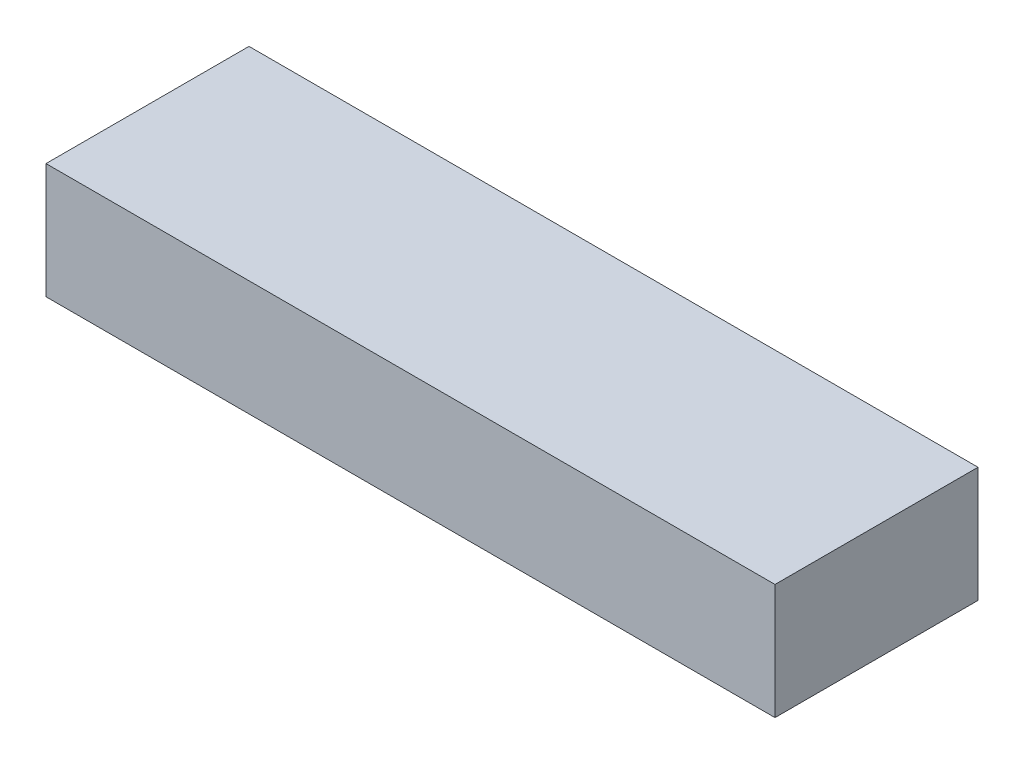
ISO-10303-21;
HEADER;
FILE_DESCRIPTION(('STEP AP214'),'2;1');
FILE_NAME('part.step','',(''),(''),'','','');
FILE_SCHEMA(('AUTOMOTIVE_DESIGN { 1 0 10303 214 1 1 1 1 }'));
ENDSEC;
DATA;
#1=APPLICATION_CONTEXT('core data for automotive mechanical design processes');
#2=APPLICATION_PROTOCOL_DEFINITION('international standard','automotive_design',2000,#1);
#3=PRODUCT_CONTEXT('',#1,'mechanical');
#4=PRODUCT('Part','Part','',(#3));
#5=PRODUCT_RELATED_PRODUCT_CATEGORY('part','',(#4));
#6=PRODUCT_DEFINITION_FORMATION('','',#4);
#7=PRODUCT_DEFINITION_CONTEXT('part definition',#1,'design');
#8=PRODUCT_DEFINITION('design','',#6,#7);
#9=PRODUCT_DEFINITION_SHAPE('','',#8);
#10=(LENGTH_UNIT() NAMED_UNIT(*) SI_UNIT(.MILLI.,.METRE.));
#11=(NAMED_UNIT(*) PLANE_ANGLE_UNIT() SI_UNIT($,.RADIAN.));
#12=(NAMED_UNIT(*) SI_UNIT($,.STERADIAN.) SOLID_ANGLE_UNIT());
#13=UNCERTAINTY_MEASURE_WITH_UNIT(LENGTH_MEASURE(1.E-05),#10,'distance_accuracy_value','');
#14=(GEOMETRIC_REPRESENTATION_CONTEXT(3) GLOBAL_UNCERTAINTY_ASSIGNED_CONTEXT((#13)) GLOBAL_UNIT_ASSIGNED_CONTEXT((#10,
#11,#12)) REPRESENTATION_CONTEXT('',''));
#15=CARTESIAN_POINT('',(0.,0.,0.));
#16=DIRECTION('',(0.,0.,1.));
#17=DIRECTION('',(1.,0.,0.));
#18=AXIS2_PLACEMENT_3D('',#15,#16,#17);
#19=CARTESIAN_POINT('',(79.,25.,22.));
#20=DIRECTION('',(-1.,0.,0.));
#21=DIRECTION('',(0.,0.,1.));
#22=AXIS2_PLACEMENT_3D('',#19,#20,#21);
#23=PLANE('',#22);
#24=DIRECTION('',(0.,0.,-1.));
#25=VECTOR('',#24,1.);
#26=CARTESIAN_POINT('',(79.,0.,22.));
#27=LINE('',#26,#25);
#28=CARTESIAN_POINT('',(79.,0.,22.));
#29=VERTEX_POINT('',#28);
#30=CARTESIAN_POINT('',(79.,0.,-22.));
#31=VERTEX_POINT('',#30);
#32=EDGE_CURVE('E113',#29,#31,#27,.T.);
#33=ORIENTED_EDGE('',*,*,#32,.T.);
#34=DIRECTION('',(0.,-1.,0.));
#35=VECTOR('',#34,1.);
#36=CARTESIAN_POINT('',(79.,25.,-22.));
#37=LINE('',#36,#35);
#38=CARTESIAN_POINT('',(79.,25.,-22.));
#39=VERTEX_POINT('',#38);
#40=EDGE_CURVE('E11',#39,#31,#37,.T.);
#41=ORIENTED_EDGE('',*,*,#40,.F.);
#42=DIRECTION('',(0.,0.,-1.));
#43=VECTOR('',#42,1.);
#44=CARTESIAN_POINT('',(79.,25.,22.));
#45=LINE('',#44,#43);
#46=CARTESIAN_POINT('',(79.,25.,22.));
#47=VERTEX_POINT('',#46);
#48=EDGE_CURVE('E97',#47,#39,#45,.T.);
#49=ORIENTED_EDGE('',*,*,#48,.F.);
#50=DIRECTION('',(0.,-1.,0.));
#51=VECTOR('',#50,1.);
#52=CARTESIAN_POINT('',(79.,25.,22.));
#53=LINE('',#52,#51);
#54=EDGE_CURVE('E109',#47,#29,#53,.T.);
#55=ORIENTED_EDGE('',*,*,#54,.T.);
#56=EDGE_LOOP('',(#33,#41,#49,#55));
#57=FACE_BOUND('',#56,.T.);
#58=ADVANCED_FACE('F45',(#57),#23,.F.);
#59=CARTESIAN_POINT('',(-79.,25.,-22.));
#60=DIRECTION('',(0.,0.,1.));
#61=DIRECTION('',(1.,0.,0.));
#62=AXIS2_PLACEMENT_3D('',#59,#60,#61);
#63=PLANE('',#62);
#64=DIRECTION('',(-1.,0.,0.));
#65=VECTOR('',#64,1.);
#66=CARTESIAN_POINT('',(-79.,0.,-22.));
#67=LINE('',#66,#65);
#68=CARTESIAN_POINT('',(-79.,0.,-22.));
#69=VERTEX_POINT('',#68);
#70=EDGE_CURVE('E102',#31,#69,#67,.T.);
#71=ORIENTED_EDGE('',*,*,#70,.T.);
#72=DIRECTION('',(0.,-1.,0.));
#73=VECTOR('',#72,1.);
#74=CARTESIAN_POINT('',(-79.,25.,-22.));
#75=LINE('',#74,#73);
#76=CARTESIAN_POINT('',(-79.,25.,-22.));
#77=VERTEX_POINT('',#76);
#78=EDGE_CURVE('E54',#77,#69,#75,.T.);
#79=ORIENTED_EDGE('',*,*,#78,.F.);
#80=DIRECTION('',(-1.,0.,0.));
#81=VECTOR('',#80,1.);
#82=CARTESIAN_POINT('',(-79.,25.,-22.));
#83=LINE('',#82,#81);
#84=EDGE_CURVE('E92',#39,#77,#83,.T.);
#85=ORIENTED_EDGE('',*,*,#84,.F.);
#86=ORIENTED_EDGE('',*,*,#40,.T.);
#87=EDGE_LOOP('',(#71,#79,#85,#86));
#88=FACE_BOUND('',#87,.T.);
#89=ADVANCED_FACE('F101',(#88),#63,.F.);
#90=CARTESIAN_POINT('',(-79.,25.,22.));
#91=DIRECTION('',(1.,0.,0.));
#92=DIRECTION('',(0.,0.,-1.));
#93=AXIS2_PLACEMENT_3D('',#90,#91,#92);
#94=PLANE('',#93);
#95=DIRECTION('',(0.,0.,1.));
#96=VECTOR('',#95,1.);
#97=CARTESIAN_POINT('',(-79.,0.,22.));
#98=LINE('',#97,#96);
#99=CARTESIAN_POINT('',(-79.,0.,22.));
#100=VERTEX_POINT('',#99);
#101=EDGE_CURVE('E79',#69,#100,#98,.T.);
#102=ORIENTED_EDGE('',*,*,#101,.T.);
#103=DIRECTION('',(0.,-1.,0.));
#104=VECTOR('',#103,1.);
#105=CARTESIAN_POINT('',(-79.,25.,22.));
#106=LINE('',#105,#104);
#107=CARTESIAN_POINT('',(-79.,25.,22.));
#108=VERTEX_POINT('',#107);
#109=EDGE_CURVE('E104',#108,#100,#106,.T.);
#110=ORIENTED_EDGE('',*,*,#109,.F.);
#111=DIRECTION('',(0.,0.,1.));
#112=VECTOR('',#111,1.);
#113=CARTESIAN_POINT('',(-79.,25.,22.));
#114=LINE('',#113,#112);
#115=EDGE_CURVE('E95',#77,#108,#114,.T.);
#116=ORIENTED_EDGE('',*,*,#115,.F.);
#117=ORIENTED_EDGE('',*,*,#78,.T.);
#118=EDGE_LOOP('',(#102,#110,#116,#117));
#119=FACE_BOUND('',#118,.T.);
#120=ADVANCED_FACE('F105',(#119),#94,.F.);
#121=CARTESIAN_POINT('',(-79.,25.,22.));
#122=DIRECTION('',(0.,0.,-1.));
#123=DIRECTION('',(-1.,0.,0.));
#124=AXIS2_PLACEMENT_3D('',#121,#122,#123);
#125=PLANE('',#124);
#126=DIRECTION('',(1.,0.,0.));
#127=VECTOR('',#126,1.);
#128=CARTESIAN_POINT('',(-79.,0.,22.));
#129=LINE('',#128,#127);
#130=EDGE_CURVE('E85',#100,#29,#129,.T.);
#131=ORIENTED_EDGE('',*,*,#130,.T.);
#132=ORIENTED_EDGE('',*,*,#54,.F.);
#133=DIRECTION('',(1.,0.,0.));
#134=VECTOR('',#133,1.);
#135=CARTESIAN_POINT('',(-79.,25.,22.));
#136=LINE('',#135,#134);
#137=EDGE_CURVE('E62',#108,#47,#136,.T.);
#138=ORIENTED_EDGE('',*,*,#137,.F.);
#139=ORIENTED_EDGE('',*,*,#109,.T.);
#140=EDGE_LOOP('',(#131,#132,#138,#139));
#141=FACE_BOUND('',#140,.T.);
#142=ADVANCED_FACE('F126',(#141),#125,.F.);
#143=CARTESIAN_POINT('',(0.,25.,0.));
#144=DIRECTION('',(0.,-1.,0.));
#145=DIRECTION('',(0.,0.,-1.));
#146=AXIS2_PLACEMENT_3D('',#143,#144,#145);
#147=PLANE('',#146);
#148=ORIENTED_EDGE('',*,*,#48,.T.);
#149=ORIENTED_EDGE('',*,*,#84,.T.);
#150=ORIENTED_EDGE('',*,*,#115,.T.);
#151=ORIENTED_EDGE('',*,*,#137,.T.);
#152=EDGE_LOOP('',(#148,#149,#150,#151));
#153=FACE_BOUND('',#152,.T.);
#154=ADVANCED_FACE('F93',(#153),#147,.F.);
#155=CARTESIAN_POINT('',(0.,0.,0.));
#156=DIRECTION('',(0.,-1.,0.));
#157=DIRECTION('',(0.,0.,-1.));
#158=AXIS2_PLACEMENT_3D('',#155,#156,#157);
#159=PLANE('',#158);
#160=ORIENTED_EDGE('',*,*,#32,.F.);
#161=ORIENTED_EDGE('',*,*,#130,.F.);
#162=ORIENTED_EDGE('',*,*,#101,.F.);
#163=ORIENTED_EDGE('',*,*,#70,.F.);
#164=EDGE_LOOP('',(#160,#161,#162,#163));
#165=FACE_BOUND('',#164,.T.);
#166=ADVANCED_FACE('F129',(#165),#159,.T.);
#167=CLOSED_SHELL('',(#58,#89,#120,#142,#154,#166));
#168=MANIFOLD_SOLID_BREP('B2',#167);
#169=ADVANCED_BREP_SHAPE_REPRESENTATION('',(#18,#168),#14);
#170=SHAPE_DEFINITION_REPRESENTATION(#9,#169);
ENDSEC;
END-ISO-10303-21;
